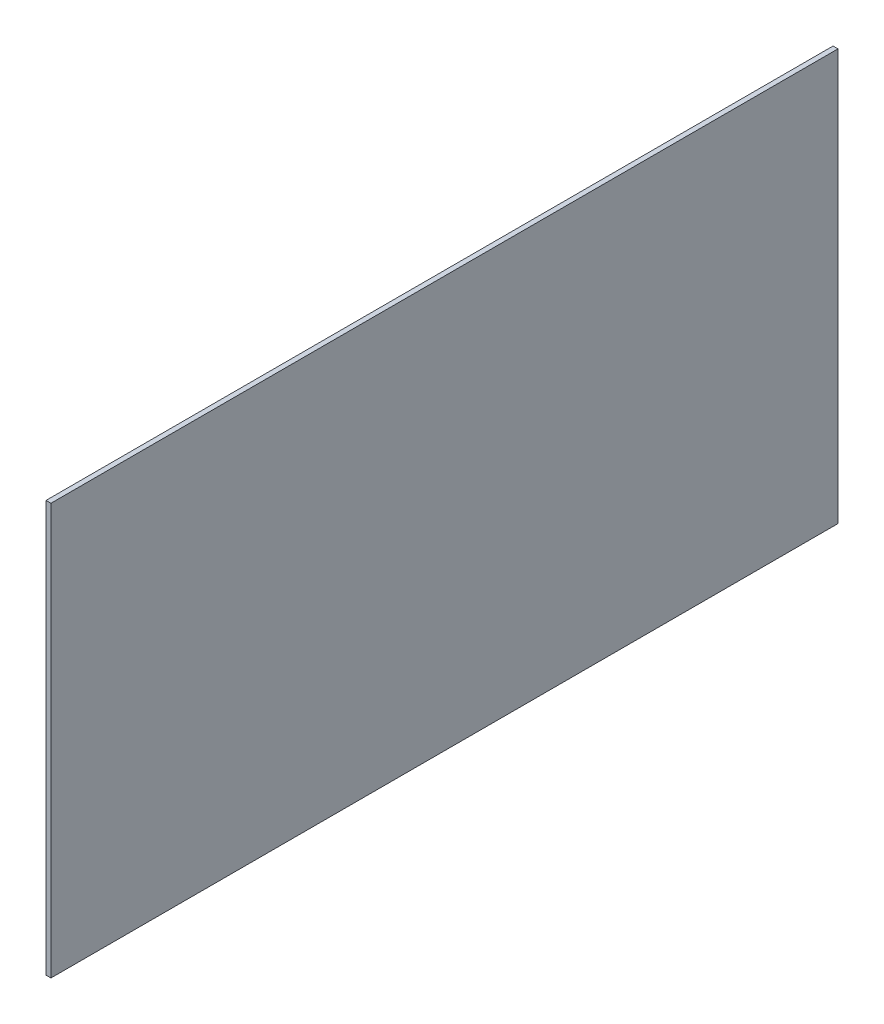
ISO-10303-21;
HEADER;
FILE_DESCRIPTION(('STEP AP214'),'2;1');
FILE_NAME('part.step','',(''),(''),'','','');
FILE_SCHEMA(('AUTOMOTIVE_DESIGN { 1 0 10303 214 1 1 1 1 }'));
ENDSEC;
DATA;
#1=APPLICATION_CONTEXT('core data for automotive mechanical design processes');
#2=APPLICATION_PROTOCOL_DEFINITION('international standard','automotive_design',2000,#1);
#3=PRODUCT_CONTEXT('',#1,'mechanical');
#4=PRODUCT('Part','Part','',(#3));
#5=PRODUCT_RELATED_PRODUCT_CATEGORY('part','',(#4));
#6=PRODUCT_DEFINITION_FORMATION('','',#4);
#7=PRODUCT_DEFINITION_CONTEXT('part definition',#1,'design');
#8=PRODUCT_DEFINITION('design','',#6,#7);
#9=PRODUCT_DEFINITION_SHAPE('','',#8);
#10=(LENGTH_UNIT() NAMED_UNIT(*) SI_UNIT(.MILLI.,.METRE.));
#11=(NAMED_UNIT(*) PLANE_ANGLE_UNIT() SI_UNIT($,.RADIAN.));
#12=(NAMED_UNIT(*) SI_UNIT($,.STERADIAN.) SOLID_ANGLE_UNIT());
#13=UNCERTAINTY_MEASURE_WITH_UNIT(LENGTH_MEASURE(1.E-05),#10,'distance_accuracy_value','');
#14=(GEOMETRIC_REPRESENTATION_CONTEXT(3) GLOBAL_UNCERTAINTY_ASSIGNED_CONTEXT((#13)) GLOBAL_UNIT_ASSIGNED_CONTEXT((#10,
#11,#12)) REPRESENTATION_CONTEXT('',''));
#15=CARTESIAN_POINT('',(0.,0.,0.));
#16=DIRECTION('',(0.,0.,1.));
#17=DIRECTION('',(1.,0.,0.));
#18=AXIS2_PLACEMENT_3D('',#15,#16,#17);
#19=CARTESIAN_POINT('',(2.667,0.,541.02));
#20=DIRECTION('',(0.,0.,-1.));
#21=DIRECTION('',(-1.,0.,0.));
#22=AXIS2_PLACEMENT_3D('',#19,#20,#21);
#23=PLANE('',#22);
#24=DIRECTION('',(0.,-1.,0.));
#25=VECTOR('',#24,1.);
#26=CARTESIAN_POINT('',(0.,0.,541.02));
#27=LINE('',#26,#25);
#28=CARTESIAN_POINT('',(0.,222.25,541.02));
#29=VERTEX_POINT('',#28);
#30=CARTESIAN_POINT('',(0.,0.,541.02));
#31=VERTEX_POINT('',#30);
#32=EDGE_CURVE('E97',#29,#31,#27,.T.);
#33=ORIENTED_EDGE('',*,*,#32,.T.);
#34=DIRECTION('',(-1.,0.,0.));
#35=VECTOR('',#34,1.);
#36=CARTESIAN_POINT('',(2.667,0.,541.02));
#37=LINE('',#36,#35);
#38=CARTESIAN_POINT('',(2.667,0.,541.02));
#39=VERTEX_POINT('',#38);
#40=EDGE_CURVE('E11',#39,#31,#37,.T.);
#41=ORIENTED_EDGE('',*,*,#40,.F.);
#42=DIRECTION('',(0.,-1.,0.));
#43=VECTOR('',#42,1.);
#44=CARTESIAN_POINT('',(2.667,0.,541.02));
#45=LINE('',#44,#43);
#46=CARTESIAN_POINT('',(2.667,222.25,541.02));
#47=VERTEX_POINT('',#46);
#48=EDGE_CURVE('E85',#47,#39,#45,.T.);
#49=ORIENTED_EDGE('',*,*,#48,.F.);
#50=DIRECTION('',(-1.,0.,0.));
#51=VECTOR('',#50,1.);
#52=CARTESIAN_POINT('',(2.667,222.25,541.02));
#53=LINE('',#52,#51);
#54=EDGE_CURVE('E93',#47,#29,#53,.T.);
#55=ORIENTED_EDGE('',*,*,#54,.T.);
#56=EDGE_LOOP('',(#33,#41,#49,#55));
#57=FACE_BOUND('',#56,.T.);
#58=ADVANCED_FACE('F34',(#57),#23,.F.);
#59=CARTESIAN_POINT('',(2.667,0.,0.));
#60=DIRECTION('',(0.,1.,0.));
#61=DIRECTION('',(0.,0.,1.));
#62=AXIS2_PLACEMENT_3D('',#59,#60,#61);
#63=PLANE('',#62);
#64=DIRECTION('',(0.,0.,-1.));
#65=VECTOR('',#64,1.);
#66=CARTESIAN_POINT('',(0.,0.,0.));
#67=LINE('',#66,#65);
#68=CARTESIAN_POINT('',(0.,0.,115.57));
#69=VERTEX_POINT('',#68);
#70=EDGE_CURVE('E89',#31,#69,#67,.T.);
#71=ORIENTED_EDGE('',*,*,#70,.T.);
#72=DIRECTION('',(-1.,0.,0.));
#73=VECTOR('',#72,1.);
#74=CARTESIAN_POINT('',(2.667,0.,115.57));
#75=LINE('',#74,#73);
#76=CARTESIAN_POINT('',(2.667,0.,115.57));
#77=VERTEX_POINT('',#76);
#78=EDGE_CURVE('E42',#77,#69,#75,.T.);
#79=ORIENTED_EDGE('',*,*,#78,.F.);
#80=DIRECTION('',(0.,0.,-1.));
#81=VECTOR('',#80,1.);
#82=CARTESIAN_POINT('',(2.667,0.,0.));
#83=LINE('',#82,#81);
#84=EDGE_CURVE('E80',#39,#77,#83,.T.);
#85=ORIENTED_EDGE('',*,*,#84,.F.);
#86=ORIENTED_EDGE('',*,*,#40,.T.);
#87=EDGE_LOOP('',(#71,#79,#85,#86));
#88=FACE_BOUND('',#87,.T.);
#89=ADVANCED_FACE('F88',(#88),#63,.F.);
#90=CARTESIAN_POINT('',(2.667,0.,115.57));
#91=DIRECTION('',(0.,0.,1.));
#92=DIRECTION('',(1.,0.,0.));
#93=AXIS2_PLACEMENT_3D('',#90,#91,#92);
#94=PLANE('',#93);
#95=DIRECTION('',(0.,1.,0.));
#96=VECTOR('',#95,1.);
#97=CARTESIAN_POINT('',(0.,0.,115.57));
#98=LINE('',#97,#96);
#99=CARTESIAN_POINT('',(0.,222.25,115.57));
#100=VERTEX_POINT('',#99);
#101=EDGE_CURVE('E67',#69,#100,#98,.T.);
#102=ORIENTED_EDGE('',*,*,#101,.T.);
#103=DIRECTION('',(-1.,0.,0.));
#104=VECTOR('',#103,1.);
#105=CARTESIAN_POINT('',(2.667,222.25,115.57));
#106=LINE('',#105,#104);
#107=CARTESIAN_POINT('',(2.667,222.25,115.57));
#108=VERTEX_POINT('',#107);
#109=EDGE_CURVE('E90',#108,#100,#106,.T.);
#110=ORIENTED_EDGE('',*,*,#109,.F.);
#111=DIRECTION('',(0.,1.,0.));
#112=VECTOR('',#111,1.);
#113=CARTESIAN_POINT('',(2.667,0.,115.57));
#114=LINE('',#113,#112);
#115=EDGE_CURVE('E83',#77,#108,#114,.T.);
#116=ORIENTED_EDGE('',*,*,#115,.F.);
#117=ORIENTED_EDGE('',*,*,#78,.T.);
#118=EDGE_LOOP('',(#102,#110,#116,#117));
#119=FACE_BOUND('',#118,.T.);
#120=ADVANCED_FACE('F91',(#119),#94,.F.);
#121=CARTESIAN_POINT('',(2.667,222.25,0.));
#122=DIRECTION('',(0.,-1.,0.));
#123=DIRECTION('',(0.,0.,-1.));
#124=AXIS2_PLACEMENT_3D('',#121,#122,#123);
#125=PLANE('',#124);
#126=DIRECTION('',(0.,0.,1.));
#127=VECTOR('',#126,1.);
#128=CARTESIAN_POINT('',(0.,222.25,0.));
#129=LINE('',#128,#127);
#130=EDGE_CURVE('E73',#100,#29,#129,.T.);
#131=ORIENTED_EDGE('',*,*,#130,.T.);
#132=ORIENTED_EDGE('',*,*,#54,.F.);
#133=DIRECTION('',(0.,0.,1.));
#134=VECTOR('',#133,1.);
#135=CARTESIAN_POINT('',(2.667,222.25,0.));
#136=LINE('',#135,#134);
#137=EDGE_CURVE('E50',#108,#47,#136,.T.);
#138=ORIENTED_EDGE('',*,*,#137,.F.);
#139=ORIENTED_EDGE('',*,*,#109,.T.);
#140=EDGE_LOOP('',(#131,#132,#138,#139));
#141=FACE_BOUND('',#140,.T.);
#142=ADVANCED_FACE('F104',(#141),#125,.F.);
#143=CARTESIAN_POINT('',(2.667,0.,0.));
#144=DIRECTION('',(1.,0.,0.));
#145=DIRECTION('',(0.,0.,-1.));
#146=AXIS2_PLACEMENT_3D('',#143,#144,#145);
#147=PLANE('',#146);
#148=ORIENTED_EDGE('',*,*,#48,.T.);
#149=ORIENTED_EDGE('',*,*,#84,.T.);
#150=ORIENTED_EDGE('',*,*,#115,.T.);
#151=ORIENTED_EDGE('',*,*,#137,.T.);
#152=EDGE_LOOP('',(#148,#149,#150,#151));
#153=FACE_BOUND('',#152,.T.);
#154=ADVANCED_FACE('F81',(#153),#147,.T.);
#155=CARTESIAN_POINT('',(0.,0.,0.));
#156=DIRECTION('',(1.,0.,0.));
#157=DIRECTION('',(0.,0.,-1.));
#158=AXIS2_PLACEMENT_3D('',#155,#156,#157);
#159=PLANE('',#158);
#160=ORIENTED_EDGE('',*,*,#32,.F.);
#161=ORIENTED_EDGE('',*,*,#130,.F.);
#162=ORIENTED_EDGE('',*,*,#101,.F.);
#163=ORIENTED_EDGE('',*,*,#70,.F.);
#164=EDGE_LOOP('',(#160,#161,#162,#163));
#165=FACE_BOUND('',#164,.T.);
#166=ADVANCED_FACE('F107',(#165),#159,.F.);
#167=CLOSED_SHELL('',(#58,#89,#120,#142,#154,#166));
#168=MANIFOLD_SOLID_BREP('B2',#167);
#169=ADVANCED_BREP_SHAPE_REPRESENTATION('',(#18,#168),#14);
#170=SHAPE_DEFINITION_REPRESENTATION(#9,#169);
ENDSEC;
END-ISO-10303-21;
